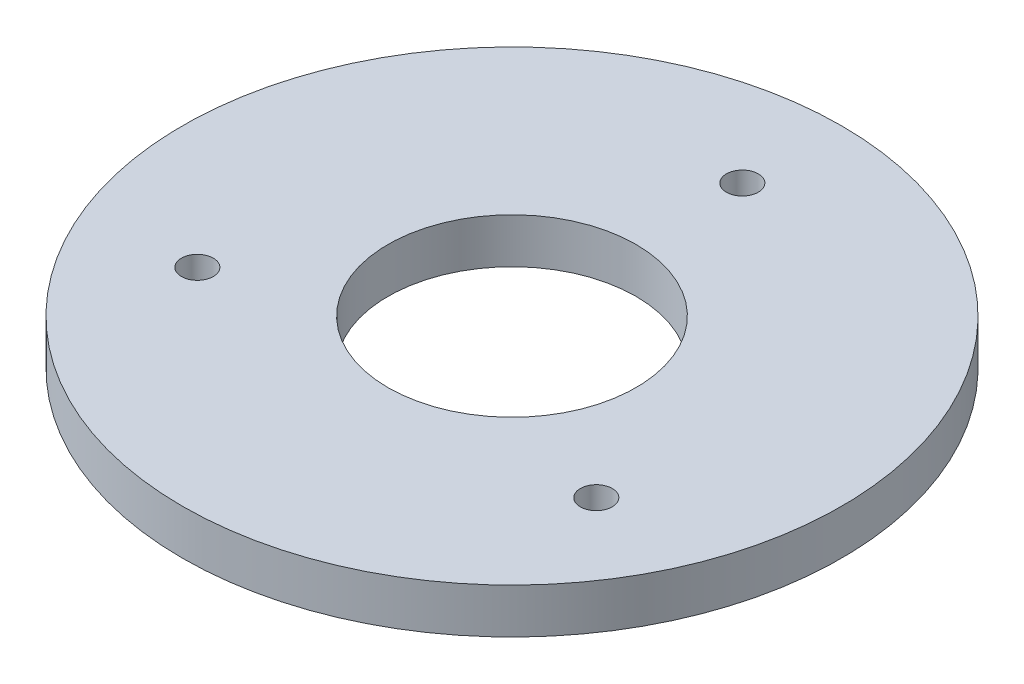
ISO-10303-21;
HEADER;
FILE_DESCRIPTION(('STEP AP214'),'2;1');
FILE_NAME('part.step','',(''),(''),'','','');
FILE_SCHEMA(('AUTOMOTIVE_DESIGN { 1 0 10303 214 1 1 1 1 }'));
ENDSEC;
DATA;
#1=APPLICATION_CONTEXT('core data for automotive mechanical design processes');
#2=APPLICATION_PROTOCOL_DEFINITION('international standard','automotive_design',2000,#1);
#3=PRODUCT_CONTEXT('',#1,'mechanical');
#4=PRODUCT('Part','Part','',(#3));
#5=PRODUCT_RELATED_PRODUCT_CATEGORY('part','',(#4));
#6=PRODUCT_DEFINITION_FORMATION('','',#4);
#7=PRODUCT_DEFINITION_CONTEXT('part definition',#1,'design');
#8=PRODUCT_DEFINITION('design','',#6,#7);
#9=PRODUCT_DEFINITION_SHAPE('','',#8);
#10=(LENGTH_UNIT() NAMED_UNIT(*) SI_UNIT(.MILLI.,.METRE.));
#11=(NAMED_UNIT(*) PLANE_ANGLE_UNIT() SI_UNIT($,.RADIAN.));
#12=(NAMED_UNIT(*) SI_UNIT($,.STERADIAN.) SOLID_ANGLE_UNIT());
#13=UNCERTAINTY_MEASURE_WITH_UNIT(LENGTH_MEASURE(1.E-05),#10,'distance_accuracy_value','');
#14=(GEOMETRIC_REPRESENTATION_CONTEXT(3) GLOBAL_UNCERTAINTY_ASSIGNED_CONTEXT((#13)) GLOBAL_UNIT_ASSIGNED_CONTEXT((#10,
#11,#12)) REPRESENTATION_CONTEXT('',''));
#15=CARTESIAN_POINT('',(0.,0.,0.));
#16=DIRECTION('',(0.,0.,1.));
#17=DIRECTION('',(1.,0.,0.));
#18=AXIS2_PLACEMENT_3D('',#15,#16,#17);
#19=CARTESIAN_POINT('',(0.,6.35,28.));
#20=DIRECTION('',(0.,1.,0.));
#21=DIRECTION('',(0.,0.,1.));
#22=AXIS2_PLACEMENT_3D('',#19,#20,#21);
#23=PLANE('',#22);
#24=CARTESIAN_POINT('',(0.,6.35,0.));
#25=DIRECTION('',(0.,1.,0.));
#26=DIRECTION('',(0.,0.,1.));
#27=AXIS2_PLACEMENT_3D('',#24,#25,#26);
#28=CIRCLE('',#27,46.5);
#29=CARTESIAN_POINT('',(0.,6.35,46.5));
#30=VERTEX_POINT('',#29);
#31=EDGE_CURVE('E39',#30,#30,#28,.T.);
#32=ORIENTED_EDGE('',*,*,#31,.T.);
#33=EDGE_LOOP('',(#32));
#34=FACE_BOUND('',#33,.T.);
#35=CARTESIAN_POINT('',(0.,6.35,0.));
#36=DIRECTION('',(0.,1.,0.));
#37=DIRECTION('',(0.,0.,1.));
#38=AXIS2_PLACEMENT_3D('',#35,#36,#37);
#39=CIRCLE('',#38,17.5);
#40=CARTESIAN_POINT('',(0.,6.35,17.5));
#41=VERTEX_POINT('',#40);
#42=EDGE_CURVE('E52',#41,#41,#39,.T.);
#43=ORIENTED_EDGE('',*,*,#42,.F.);
#44=EDGE_LOOP('',(#43));
#45=FACE_BOUND('',#44,.T.);
#46=CARTESIAN_POINT('',(-28.1458256229942,6.35,16.25));
#47=DIRECTION('',(0.,1.,0.));
#48=DIRECTION('',(0.,0.,1.));
#49=AXIS2_PLACEMENT_3D('',#46,#47,#48);
#50=CIRCLE('',#49,2.25);
#51=CARTESIAN_POINT('',(-28.1458256229942,6.35,18.5));
#52=VERTEX_POINT('',#51);
#53=EDGE_CURVE('E10',#52,#52,#50,.T.);
#54=ORIENTED_EDGE('',*,*,#53,.F.);
#55=EDGE_LOOP('',(#54));
#56=FACE_BOUND('',#55,.T.);
#57=CARTESIAN_POINT('',(28.1458256229943,6.35,16.25));
#58=DIRECTION('',(0.,1.,0.));
#59=DIRECTION('',(0.,0.,1.));
#60=AXIS2_PLACEMENT_3D('',#57,#58,#59);
#61=CIRCLE('',#60,2.25);
#62=CARTESIAN_POINT('',(28.1458256229943,6.35,18.5));
#63=VERTEX_POINT('',#62);
#64=EDGE_CURVE('E43',#63,#63,#61,.T.);
#65=ORIENTED_EDGE('',*,*,#64,.F.);
#66=EDGE_LOOP('',(#65));
#67=FACE_BOUND('',#66,.T.);
#68=CARTESIAN_POINT('',(0.,6.35,-32.5));
#69=DIRECTION('',(0.,1.,0.));
#70=DIRECTION('',(0.,0.,1.));
#71=AXIS2_PLACEMENT_3D('',#68,#69,#70);
#72=CIRCLE('',#71,2.25);
#73=CARTESIAN_POINT('',(0.,6.35,-30.25));
#74=VERTEX_POINT('',#73);
#75=EDGE_CURVE('E48',#74,#74,#72,.T.);
#76=ORIENTED_EDGE('',*,*,#75,.F.);
#77=EDGE_LOOP('',(#76));
#78=FACE_BOUND('',#77,.T.);
#79=ADVANCED_FACE('F35',(#34,#45,#56,#67,#78),#23,.T.);
#80=CARTESIAN_POINT('',(0.,0.,0.));
#81=DIRECTION('',(0.,1.,0.));
#82=DIRECTION('',(0.,0.,1.));
#83=AXIS2_PLACEMENT_3D('',#80,#81,#82);
#84=PLANE('',#83);
#85=CARTESIAN_POINT('',(0.,0.,0.));
#86=DIRECTION('',(0.,1.,0.));
#87=DIRECTION('',(0.,0.,1.));
#88=AXIS2_PLACEMENT_3D('',#85,#86,#87);
#89=CIRCLE('',#88,46.5);
#90=CARTESIAN_POINT('',(0.,0.,46.5));
#91=VERTEX_POINT('',#90);
#92=EDGE_CURVE('E56',#91,#91,#89,.T.);
#93=ORIENTED_EDGE('',*,*,#92,.F.);
#94=EDGE_LOOP('',(#93));
#95=FACE_BOUND('',#94,.T.);
#96=CARTESIAN_POINT('',(0.,0.,-32.5));
#97=DIRECTION('',(0.,1.,0.));
#98=DIRECTION('',(0.,0.,1.));
#99=AXIS2_PLACEMENT_3D('',#96,#97,#98);
#100=CIRCLE('',#99,2.25);
#101=CARTESIAN_POINT('',(0.,0.,-30.25));
#102=VERTEX_POINT('',#101);
#103=EDGE_CURVE('E59',#102,#102,#100,.T.);
#104=ORIENTED_EDGE('',*,*,#103,.T.);
#105=EDGE_LOOP('',(#104));
#106=FACE_BOUND('',#105,.T.);
#107=CARTESIAN_POINT('',(0.,0.,0.));
#108=DIRECTION('',(0.,1.,0.));
#109=DIRECTION('',(0.,0.,1.));
#110=AXIS2_PLACEMENT_3D('',#107,#108,#109);
#111=CIRCLE('',#110,17.5);
#112=CARTESIAN_POINT('',(0.,0.,17.5));
#113=VERTEX_POINT('',#112);
#114=EDGE_CURVE('E62',#113,#113,#111,.T.);
#115=ORIENTED_EDGE('',*,*,#114,.T.);
#116=EDGE_LOOP('',(#115));
#117=FACE_BOUND('',#116,.T.);
#118=CARTESIAN_POINT('',(28.1458256229943,0.,16.25));
#119=DIRECTION('',(0.,1.,0.));
#120=DIRECTION('',(0.,0.,1.));
#121=AXIS2_PLACEMENT_3D('',#118,#119,#120);
#122=CIRCLE('',#121,2.25);
#123=CARTESIAN_POINT('',(28.1458256229943,0.,18.5));
#124=VERTEX_POINT('',#123);
#125=EDGE_CURVE('E65',#124,#124,#122,.T.);
#126=ORIENTED_EDGE('',*,*,#125,.T.);
#127=EDGE_LOOP('',(#126));
#128=FACE_BOUND('',#127,.T.);
#129=CARTESIAN_POINT('',(-28.1458256229942,0.,16.25));
#130=DIRECTION('',(0.,1.,0.));
#131=DIRECTION('',(0.,0.,1.));
#132=AXIS2_PLACEMENT_3D('',#129,#130,#131);
#133=CIRCLE('',#132,2.25);
#134=CARTESIAN_POINT('',(-28.1458256229942,0.,18.5));
#135=VERTEX_POINT('',#134);
#136=EDGE_CURVE('E55',#135,#135,#133,.T.);
#137=ORIENTED_EDGE('',*,*,#136,.T.);
#138=EDGE_LOOP('',(#137));
#139=FACE_BOUND('',#138,.T.);
#140=ADVANCED_FACE('F70',(#95,#106,#117,#128,#139),#84,.F.);
#141=CARTESIAN_POINT('',(0.,12.7,-32.5));
#142=DIRECTION('',(0.,-1.,0.));
#143=DIRECTION('',(0.,0.,-1.));
#144=AXIS2_PLACEMENT_3D('',#141,#142,#143);
#145=CYLINDRICAL_SURFACE('',#144,2.25);
#146=ORIENTED_EDGE('',*,*,#103,.F.);
#147=EDGE_LOOP('',(#146));
#148=FACE_BOUND('',#147,.T.);
#149=ORIENTED_EDGE('',*,*,#75,.T.);
#150=EDGE_LOOP('',(#149));
#151=FACE_BOUND('',#150,.T.);
#152=ADVANCED_FACE('F83',(#148,#151),#145,.F.);
#153=CARTESIAN_POINT('',(28.1458256229943,12.7,16.25));
#154=DIRECTION('',(0.,-1.,0.));
#155=DIRECTION('',(0.,0.,-1.));
#156=AXIS2_PLACEMENT_3D('',#153,#154,#155);
#157=CYLINDRICAL_SURFACE('',#156,2.25);
#158=ORIENTED_EDGE('',*,*,#125,.F.);
#159=EDGE_LOOP('',(#158));
#160=FACE_BOUND('',#159,.T.);
#161=ORIENTED_EDGE('',*,*,#64,.T.);
#162=EDGE_LOOP('',(#161));
#163=FACE_BOUND('',#162,.T.);
#164=ADVANCED_FACE('F75',(#160,#163),#157,.F.);
#165=CARTESIAN_POINT('',(-28.1458256229942,12.7,16.25));
#166=DIRECTION('',(0.,-1.,0.));
#167=DIRECTION('',(0.,0.,-1.));
#168=AXIS2_PLACEMENT_3D('',#165,#166,#167);
#169=CYLINDRICAL_SURFACE('',#168,2.25);
#170=ORIENTED_EDGE('',*,*,#136,.F.);
#171=EDGE_LOOP('',(#170));
#172=FACE_BOUND('',#171,.T.);
#173=ORIENTED_EDGE('',*,*,#53,.T.);
#174=EDGE_LOOP('',(#173));
#175=FACE_BOUND('',#174,.T.);
#176=ADVANCED_FACE('F72',(#172,#175),#169,.F.);
#177=CARTESIAN_POINT('',(0.,12.7,0.));
#178=DIRECTION('',(0.,-1.,0.));
#179=DIRECTION('',(0.,0.,-1.));
#180=AXIS2_PLACEMENT_3D('',#177,#178,#179);
#181=CYLINDRICAL_SURFACE('',#180,17.5);
#182=ORIENTED_EDGE('',*,*,#114,.F.);
#183=EDGE_LOOP('',(#182));
#184=FACE_BOUND('',#183,.T.);
#185=ORIENTED_EDGE('',*,*,#42,.T.);
#186=EDGE_LOOP('',(#185));
#187=FACE_BOUND('',#186,.T.);
#188=ADVANCED_FACE('F74',(#184,#187),#181,.F.);
#189=CARTESIAN_POINT('',(0.,12.7,0.));
#190=DIRECTION('',(0.,-1.,0.));
#191=DIRECTION('',(0.,0.,-1.));
#192=AXIS2_PLACEMENT_3D('',#189,#190,#191);
#193=CYLINDRICAL_SURFACE('',#192,46.5);
#194=ORIENTED_EDGE('',*,*,#92,.T.);
#195=EDGE_LOOP('',(#194));
#196=FACE_BOUND('',#195,.T.);
#197=ORIENTED_EDGE('',*,*,#31,.F.);
#198=EDGE_LOOP('',(#197));
#199=FACE_BOUND('',#198,.T.);
#200=ADVANCED_FACE('F37',(#196,#199),#193,.T.);
#201=CLOSED_SHELL('',(#79,#140,#152,#164,#176,#188,#200));
#202=MANIFOLD_SOLID_BREP('B2',#201);
#203=ADVANCED_BREP_SHAPE_REPRESENTATION('',(#18,#202),#14);
#204=SHAPE_DEFINITION_REPRESENTATION(#9,#203);
ENDSEC;
END-ISO-10303-21;
